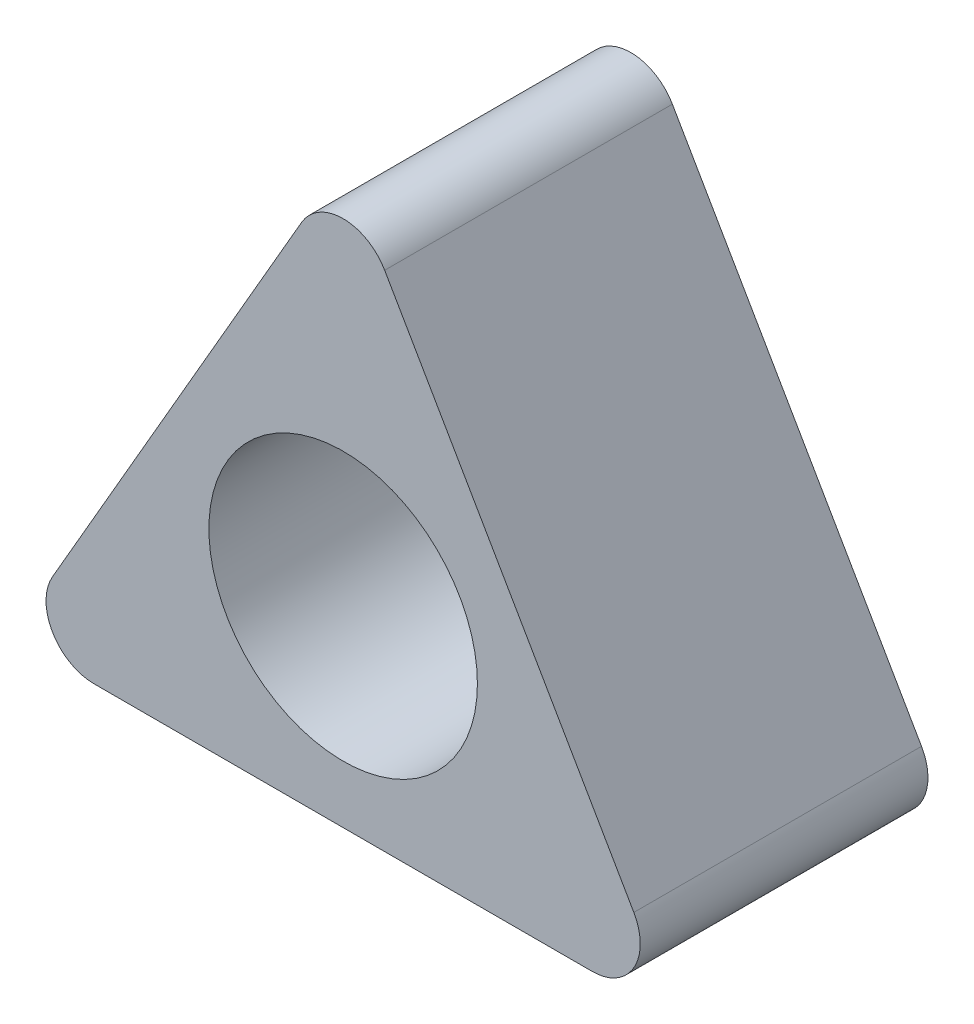
ISO-10303-21;
HEADER;
FILE_DESCRIPTION(('STEP AP214'),'2;1');
FILE_NAME('part.step','',(''),(''),'','','');
FILE_SCHEMA(('AUTOMOTIVE_DESIGN { 1 0 10303 214 1 1 1 1 }'));
ENDSEC;
DATA;
#1=APPLICATION_CONTEXT('core data for automotive mechanical design processes');
#2=APPLICATION_PROTOCOL_DEFINITION('international standard','automotive_design',2000,#1);
#3=PRODUCT_CONTEXT('',#1,'mechanical');
#4=PRODUCT('Part','Part','',(#3));
#5=PRODUCT_RELATED_PRODUCT_CATEGORY('part','',(#4));
#6=PRODUCT_DEFINITION_FORMATION('','',#4);
#7=PRODUCT_DEFINITION_CONTEXT('part definition',#1,'design');
#8=PRODUCT_DEFINITION('design','',#6,#7);
#9=PRODUCT_DEFINITION_SHAPE('','',#8);
#10=(LENGTH_UNIT() NAMED_UNIT(*) SI_UNIT(.MILLI.,.METRE.));
#11=(NAMED_UNIT(*) PLANE_ANGLE_UNIT() SI_UNIT($,.RADIAN.));
#12=(NAMED_UNIT(*) SI_UNIT($,.STERADIAN.) SOLID_ANGLE_UNIT());
#13=UNCERTAINTY_MEASURE_WITH_UNIT(LENGTH_MEASURE(1.E-05),#10,'distance_accuracy_value','');
#14=(GEOMETRIC_REPRESENTATION_CONTEXT(3) GLOBAL_UNCERTAINTY_ASSIGNED_CONTEXT((#13)) GLOBAL_UNIT_ASSIGNED_CONTEXT((#10,
#11,#12)) REPRESENTATION_CONTEXT('',''));
#15=CARTESIAN_POINT('',(0.,0.,0.));
#16=DIRECTION('',(0.,0.,1.));
#17=DIRECTION('',(1.,0.,0.));
#18=AXIS2_PLACEMENT_3D('',#15,#16,#17);
#19=CARTESIAN_POINT('',(-34.6410161513776,-20.,30.));
#20=DIRECTION('',(0.866025403784439,-0.5,0.));
#21=DIRECTION('',(0.5,0.866025403784439,0.));
#22=AXIS2_PLACEMENT_3D('',#19,#20,#21);
#23=PLANE('',#22);
#24=DIRECTION('',(-0.5,-0.866025403784439,0.));
#25=VECTOR('',#24,1.);
#26=CARTESIAN_POINT('',(-34.6410161513776,-20.,0.));
#27=LINE('',#26,#25);
#28=CARTESIAN_POINT('',(-4.33012701892219,32.5,0.));
#29=VERTEX_POINT('',#28);
#30=CARTESIAN_POINT('',(-30.3108891324554,-12.5,0.));
#31=VERTEX_POINT('',#30);
#32=EDGE_CURVE('E116',#29,#31,#27,.T.);
#33=ORIENTED_EDGE('',*,*,#32,.T.);
#34=DIRECTION('',(0.,0.,-1.));
#35=VECTOR('',#34,1.);
#36=CARTESIAN_POINT('',(-30.3108891324554,-12.5,30.));
#37=LINE('',#36,#35);
#38=CARTESIAN_POINT('',(-30.3108891324554,-12.5,30.));
#39=VERTEX_POINT('',#38);
#40=EDGE_CURVE('E11',#31,#39,#37,.F.);
#41=ORIENTED_EDGE('',*,*,#40,.T.);
#42=DIRECTION('',(-0.5,-0.866025403784439,0.));
#43=VECTOR('',#42,1.);
#44=CARTESIAN_POINT('',(-34.6410161513776,-20.,30.));
#45=LINE('',#44,#43);
#46=CARTESIAN_POINT('',(-4.33012701892219,32.5,30.));
#47=VERTEX_POINT('',#46);
#48=EDGE_CURVE('E111',#47,#39,#45,.T.);
#49=ORIENTED_EDGE('',*,*,#48,.F.);
#50=DIRECTION('',(0.,0.,-1.));
#51=VECTOR('',#50,1.);
#52=CARTESIAN_POINT('',(-4.33012701892219,32.5,30.));
#53=LINE('',#52,#51);
#54=EDGE_CURVE('E41',#47,#29,#53,.T.);
#55=ORIENTED_EDGE('',*,*,#54,.T.);
#56=EDGE_LOOP('',(#33,#41,#49,#55));
#57=FACE_BOUND('',#56,.T.);
#58=ADVANCED_FACE('F33',(#57),#23,.F.);
#59=CARTESIAN_POINT('',(34.6410161513776,-20.,30.));
#60=DIRECTION('',(0.,1.,0.));
#61=DIRECTION('',(0.,0.,1.));
#62=AXIS2_PLACEMENT_3D('',#59,#60,#61);
#63=PLANE('',#62);
#64=DIRECTION('',(1.,0.,0.));
#65=VECTOR('',#64,1.);
#66=CARTESIAN_POINT('',(34.6410161513776,-20.,0.));
#67=LINE('',#66,#65);
#68=CARTESIAN_POINT('',(-25.9807621135332,-20.,0.));
#69=VERTEX_POINT('',#68);
#70=CARTESIAN_POINT('',(25.9807621135332,-20.,0.));
#71=VERTEX_POINT('',#70);
#72=EDGE_CURVE('E112',#69,#71,#67,.T.);
#73=ORIENTED_EDGE('',*,*,#72,.T.);
#74=DIRECTION('',(0.,0.,-1.));
#75=VECTOR('',#74,1.);
#76=CARTESIAN_POINT('',(25.9807621135332,-20.,30.));
#77=LINE('',#76,#75);
#78=CARTESIAN_POINT('',(25.9807621135332,-20.,30.));
#79=VERTEX_POINT('',#78);
#80=EDGE_CURVE('E91',#71,#79,#77,.F.);
#81=ORIENTED_EDGE('',*,*,#80,.T.);
#82=DIRECTION('',(1.,0.,0.));
#83=VECTOR('',#82,1.);
#84=CARTESIAN_POINT('',(34.6410161513776,-20.,30.));
#85=LINE('',#84,#83);
#86=CARTESIAN_POINT('',(-25.9807621135332,-20.,30.));
#87=VERTEX_POINT('',#86);
#88=EDGE_CURVE('E114',#87,#79,#85,.T.);
#89=ORIENTED_EDGE('',*,*,#88,.F.);
#90=DIRECTION('',(0.,0.,-1.));
#91=VECTOR('',#90,1.);
#92=CARTESIAN_POINT('',(-25.9807621135332,-20.,30.));
#93=LINE('',#92,#91);
#94=EDGE_CURVE('E96',#87,#69,#93,.T.);
#95=ORIENTED_EDGE('',*,*,#94,.T.);
#96=EDGE_LOOP('',(#73,#81,#89,#95));
#97=FACE_BOUND('',#96,.T.);
#98=ADVANCED_FACE('F153',(#97),#63,.F.);
#99=CARTESIAN_POINT('',(0.,40.,30.));
#100=DIRECTION('',(-0.866025403784439,-0.5,0.));
#101=DIRECTION('',(0.5,-0.866025403784439,0.));
#102=AXIS2_PLACEMENT_3D('',#99,#100,#101);
#103=PLANE('',#102);
#104=DIRECTION('',(-0.5,0.866025403784439,0.));
#105=VECTOR('',#104,1.);
#106=CARTESIAN_POINT('',(0.,40.,30.));
#107=LINE('',#106,#105);
#108=CARTESIAN_POINT('',(30.3108891324554,-12.5,30.));
#109=VERTEX_POINT('',#108);
#110=CARTESIAN_POINT('',(4.33012701892219,32.5,30.));
#111=VERTEX_POINT('',#110);
#112=EDGE_CURVE('E105',#109,#111,#107,.T.);
#113=ORIENTED_EDGE('',*,*,#112,.F.);
#114=DIRECTION('',(0.,0.,-1.));
#115=VECTOR('',#114,1.);
#116=CARTESIAN_POINT('',(30.3108891324554,-12.5,30.));
#117=LINE('',#116,#115);
#118=CARTESIAN_POINT('',(30.3108891324554,-12.5,0.));
#119=VERTEX_POINT('',#118);
#120=EDGE_CURVE('E90',#109,#119,#117,.T.);
#121=ORIENTED_EDGE('',*,*,#120,.T.);
#122=DIRECTION('',(-0.5,0.866025403784439,0.));
#123=VECTOR('',#122,1.);
#124=CARTESIAN_POINT('',(0.,40.,0.));
#125=LINE('',#124,#123);
#126=CARTESIAN_POINT('',(4.33012701892219,32.5,0.));
#127=VERTEX_POINT('',#126);
#128=EDGE_CURVE('E103',#119,#127,#125,.T.);
#129=ORIENTED_EDGE('',*,*,#128,.T.);
#130=DIRECTION('',(0.,0.,-1.));
#131=VECTOR('',#130,1.);
#132=CARTESIAN_POINT('',(4.33012701892219,32.5,30.));
#133=LINE('',#132,#131);
#134=EDGE_CURVE('E107',#127,#111,#133,.F.);
#135=ORIENTED_EDGE('',*,*,#134,.T.);
#136=EDGE_LOOP('',(#113,#121,#129,#135));
#137=FACE_BOUND('',#136,.T.);
#138=ADVANCED_FACE('F102',(#137),#103,.F.);
#139=CARTESIAN_POINT('',(0.,0.,30.));
#140=DIRECTION('',(0.,0.,-1.));
#141=DIRECTION('',(-1.,0.,0.));
#142=AXIS2_PLACEMENT_3D('',#139,#140,#141);
#143=PLANE('',#142);
#144=CARTESIAN_POINT('',(0.,0.,30.));
#145=DIRECTION('',(0.,0.,1.));
#146=DIRECTION('',(1.,0.,0.));
#147=AXIS2_PLACEMENT_3D('',#144,#145,#146);
#148=CIRCLE('',#147,14.);
#149=CARTESIAN_POINT('',(14.,0.,30.));
#150=VERTEX_POINT('',#149);
#151=EDGE_CURVE('E135',#150,#150,#148,.T.);
#152=ORIENTED_EDGE('',*,*,#151,.F.);
#153=EDGE_LOOP('',(#152));
#154=FACE_BOUND('',#153,.T.);
#155=ORIENTED_EDGE('',*,*,#88,.T.);
#156=CARTESIAN_POINT('',(25.9807621135332,-15.,30.));
#157=DIRECTION('',(0.,0.,-1.));
#158=DIRECTION('',(-1.,0.,0.));
#159=AXIS2_PLACEMENT_3D('',#156,#157,#158);
#160=CIRCLE('',#159,5.);
#161=EDGE_CURVE('E129',#79,#109,#160,.F.);
#162=ORIENTED_EDGE('',*,*,#161,.T.);
#163=ORIENTED_EDGE('',*,*,#112,.T.);
#164=CARTESIAN_POINT('',(0.,30.,30.));
#165=DIRECTION('',(0.,0.,-1.));
#166=DIRECTION('',(-1.,0.,0.));
#167=AXIS2_PLACEMENT_3D('',#164,#165,#166);
#168=CIRCLE('',#167,5.);
#169=EDGE_CURVE('E53',#111,#47,#168,.F.);
#170=ORIENTED_EDGE('',*,*,#169,.T.);
#171=ORIENTED_EDGE('',*,*,#48,.T.);
#172=CARTESIAN_POINT('',(-25.9807621135332,-15.,30.));
#173=DIRECTION('',(0.,0.,-1.));
#174=DIRECTION('',(-1.,0.,0.));
#175=AXIS2_PLACEMENT_3D('',#172,#173,#174);
#176=CIRCLE('',#175,5.);
#177=EDGE_CURVE('E127',#39,#87,#176,.F.);
#178=ORIENTED_EDGE('',*,*,#177,.T.);
#179=EDGE_LOOP('',(#155,#162,#163,#170,#171,#178));
#180=FACE_BOUND('',#179,.T.);
#181=ADVANCED_FACE('F146',(#154,#180),#143,.F.);
#182=CARTESIAN_POINT('',(0.,0.,0.));
#183=DIRECTION('',(0.,0.,-1.));
#184=DIRECTION('',(-1.,0.,0.));
#185=AXIS2_PLACEMENT_3D('',#182,#183,#184);
#186=PLANE('',#185);
#187=CARTESIAN_POINT('',(0.,0.,0.));
#188=DIRECTION('',(0.,0.,1.));
#189=DIRECTION('',(1.,0.,0.));
#190=AXIS2_PLACEMENT_3D('',#187,#188,#189);
#191=CIRCLE('',#190,14.);
#192=CARTESIAN_POINT('',(14.,0.,0.));
#193=VERTEX_POINT('',#192);
#194=EDGE_CURVE('E133',#193,#193,#191,.T.);
#195=ORIENTED_EDGE('',*,*,#194,.T.);
#196=EDGE_LOOP('',(#195));
#197=FACE_BOUND('',#196,.T.);
#198=ORIENTED_EDGE('',*,*,#128,.F.);
#199=CARTESIAN_POINT('',(25.9807621135332,-15.,0.));
#200=DIRECTION('',(0.,0.,-1.));
#201=DIRECTION('',(-1.,0.,0.));
#202=AXIS2_PLACEMENT_3D('',#199,#200,#201);
#203=CIRCLE('',#202,5.);
#204=EDGE_CURVE('E86',#119,#71,#203,.T.);
#205=ORIENTED_EDGE('',*,*,#204,.T.);
#206=ORIENTED_EDGE('',*,*,#72,.F.);
#207=CARTESIAN_POINT('',(-25.9807621135332,-15.,0.));
#208=DIRECTION('',(0.,0.,-1.));
#209=DIRECTION('',(-1.,0.,0.));
#210=AXIS2_PLACEMENT_3D('',#207,#208,#209);
#211=CIRCLE('',#210,5.);
#212=EDGE_CURVE('E97',#69,#31,#211,.T.);
#213=ORIENTED_EDGE('',*,*,#212,.T.);
#214=ORIENTED_EDGE('',*,*,#32,.F.);
#215=CARTESIAN_POINT('',(0.,30.,0.));
#216=DIRECTION('',(0.,0.,-1.));
#217=DIRECTION('',(-1.,0.,0.));
#218=AXIS2_PLACEMENT_3D('',#215,#216,#217);
#219=CIRCLE('',#218,5.);
#220=EDGE_CURVE('E106',#29,#127,#219,.T.);
#221=ORIENTED_EDGE('',*,*,#220,.T.);
#222=EDGE_LOOP('',(#198,#205,#206,#213,#214,#221));
#223=FACE_BOUND('',#222,.T.);
#224=ADVANCED_FACE('F109',(#197,#223),#186,.T.);
#225=CARTESIAN_POINT('',(25.9807621135332,-15.,30.));
#226=DIRECTION('',(0.,0.,-1.));
#227=DIRECTION('',(-1.,0.,0.));
#228=AXIS2_PLACEMENT_3D('',#225,#226,#227);
#229=CYLINDRICAL_SURFACE('',#228,5.);
#230=ORIENTED_EDGE('',*,*,#161,.F.);
#231=ORIENTED_EDGE('',*,*,#80,.F.);
#232=ORIENTED_EDGE('',*,*,#204,.F.);
#233=ORIENTED_EDGE('',*,*,#120,.F.);
#234=EDGE_LOOP('',(#230,#231,#232,#233));
#235=FACE_BOUND('',#234,.T.);
#236=ADVANCED_FACE('F89',(#235),#229,.T.);
#237=CARTESIAN_POINT('',(-25.9807621135332,-15.,30.));
#238=DIRECTION('',(0.,0.,-1.));
#239=DIRECTION('',(-1.,0.,0.));
#240=AXIS2_PLACEMENT_3D('',#237,#238,#239);
#241=CYLINDRICAL_SURFACE('',#240,5.);
#242=ORIENTED_EDGE('',*,*,#177,.F.);
#243=ORIENTED_EDGE('',*,*,#40,.F.);
#244=ORIENTED_EDGE('',*,*,#212,.F.);
#245=ORIENTED_EDGE('',*,*,#94,.F.);
#246=EDGE_LOOP('',(#242,#243,#244,#245));
#247=FACE_BOUND('',#246,.T.);
#248=ADVANCED_FACE('F155',(#247),#241,.T.);
#249=CARTESIAN_POINT('',(0.,30.,30.));
#250=DIRECTION('',(0.,0.,-1.));
#251=DIRECTION('',(-1.,0.,0.));
#252=AXIS2_PLACEMENT_3D('',#249,#250,#251);
#253=CYLINDRICAL_SURFACE('',#252,5.);
#254=ORIENTED_EDGE('',*,*,#169,.F.);
#255=ORIENTED_EDGE('',*,*,#134,.F.);
#256=ORIENTED_EDGE('',*,*,#220,.F.);
#257=ORIENTED_EDGE('',*,*,#54,.F.);
#258=EDGE_LOOP('',(#254,#255,#256,#257));
#259=FACE_BOUND('',#258,.T.);
#260=ADVANCED_FACE('F35',(#259),#253,.T.);
#261=CARTESIAN_POINT('',(0.,0.,0.));
#262=DIRECTION('',(0.,0.,1.));
#263=DIRECTION('',(1.,0.,0.));
#264=AXIS2_PLACEMENT_3D('',#261,#262,#263);
#265=CYLINDRICAL_SURFACE('',#264,14.);
#266=ORIENTED_EDGE('',*,*,#194,.F.);
#267=EDGE_LOOP('',(#266));
#268=FACE_BOUND('',#267,.T.);
#269=ORIENTED_EDGE('',*,*,#151,.T.);
#270=EDGE_LOOP('',(#269));
#271=FACE_BOUND('',#270,.T.);
#272=ADVANCED_FACE('F144',(#268,#271),#265,.F.);
#273=CLOSED_SHELL('',(#58,#98,#138,#181,#224,#236,#248,#260,#272));
#274=MANIFOLD_SOLID_BREP('B2',#273);
#275=ADVANCED_BREP_SHAPE_REPRESENTATION('',(#18,#274),#14);
#276=SHAPE_DEFINITION_REPRESENTATION(#9,#275);
ENDSEC;
END-ISO-10303-21;
